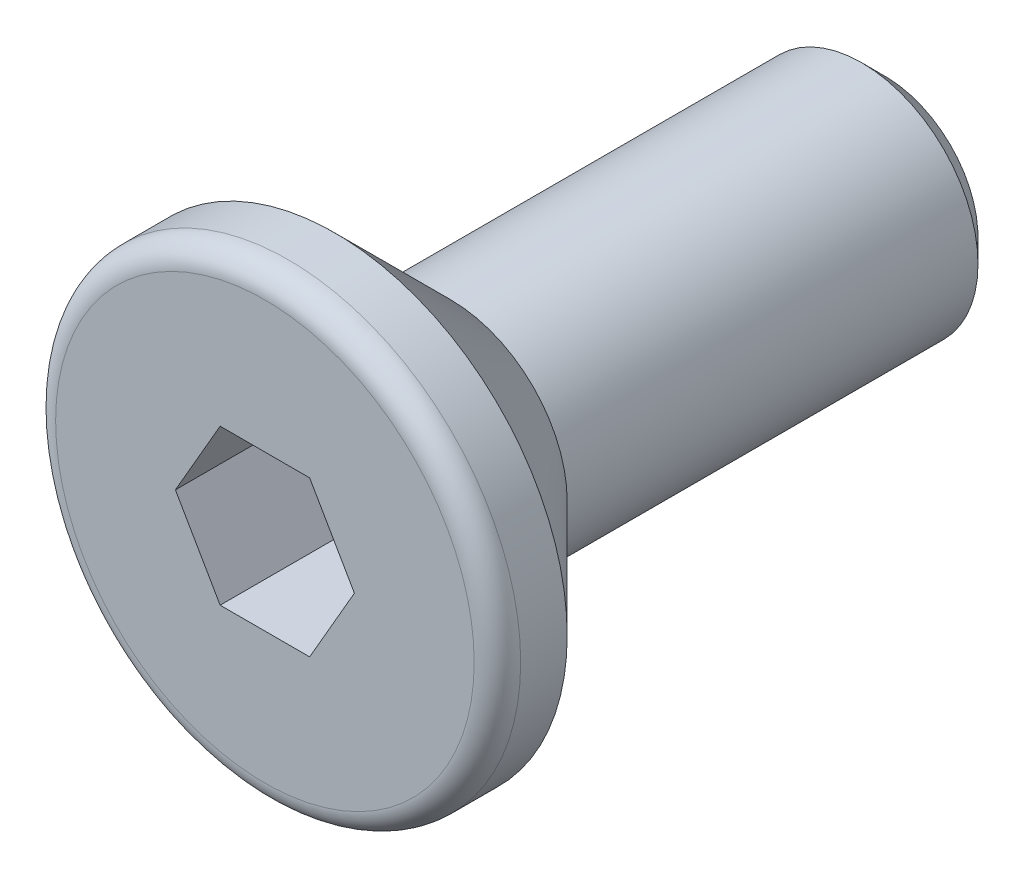
ISO-10303-21;
HEADER;
FILE_DESCRIPTION(('STEP AP214'),'2;1');
FILE_NAME('part.step','',(''),(''),'','','');
FILE_SCHEMA(('AUTOMOTIVE_DESIGN { 1 0 10303 214 1 1 1 1 }'));
ENDSEC;
DATA;
#1=APPLICATION_CONTEXT('core data for automotive mechanical design processes');
#2=APPLICATION_PROTOCOL_DEFINITION('international standard','automotive_design',2000,#1);
#3=PRODUCT_CONTEXT('',#1,'mechanical');
#4=PRODUCT('Part','Part','',(#3));
#5=PRODUCT_RELATED_PRODUCT_CATEGORY('part','',(#4));
#6=PRODUCT_DEFINITION_FORMATION('','',#4);
#7=PRODUCT_DEFINITION_CONTEXT('part definition',#1,'design');
#8=PRODUCT_DEFINITION('design','',#6,#7);
#9=PRODUCT_DEFINITION_SHAPE('','',#8);
#10=(LENGTH_UNIT() NAMED_UNIT(*) SI_UNIT(.MILLI.,.METRE.));
#11=(NAMED_UNIT(*) PLANE_ANGLE_UNIT() SI_UNIT($,.RADIAN.));
#12=(NAMED_UNIT(*) SI_UNIT($,.STERADIAN.) SOLID_ANGLE_UNIT());
#13=UNCERTAINTY_MEASURE_WITH_UNIT(LENGTH_MEASURE(1.E-05),#10,'distance_accuracy_value','');
#14=(GEOMETRIC_REPRESENTATION_CONTEXT(3) GLOBAL_UNCERTAINTY_ASSIGNED_CONTEXT((#13)) GLOBAL_UNIT_ASSIGNED_CONTEXT((#10,
#11,#12)) REPRESENTATION_CONTEXT('',''));
#15=CARTESIAN_POINT('',(0.,0.,0.));
#16=DIRECTION('',(0.,0.,1.));
#17=DIRECTION('',(1.,0.,0.));
#18=AXIS2_PLACEMENT_3D('',#15,#16,#17);
#19=CARTESIAN_POINT('',(0.,0.,4.));
#20=DIRECTION('',(0.,0.,1.));
#21=DIRECTION('',(1.,0.,0.));
#22=AXIS2_PLACEMENT_3D('',#19,#20,#21);
#23=PLANE('',#22);
#24=CARTESIAN_POINT('',(0.,0.,4.));
#25=DIRECTION('',(0.,0.,1.));
#26=DIRECTION('',(1.,0.,0.));
#27=AXIS2_PLACEMENT_3D('',#24,#25,#26);
#28=CIRCLE('',#27,2.7);
#29=CARTESIAN_POINT('',(2.7,0.,4.));
#30=VERTEX_POINT('',#29);
#31=EDGE_CURVE('E11',#30,#30,#28,.T.);
#32=ORIENTED_EDGE('',*,*,#31,.T.);
#33=EDGE_LOOP('',(#32));
#34=FACE_BOUND('',#33,.T.);
#35=DIRECTION('',(0.5,0.866025403784439,0.));
#36=VECTOR('',#35,1.);
#37=CARTESIAN_POINT('',(0.577350269189626,-1.,4.));
#38=LINE('',#37,#36);
#39=CARTESIAN_POINT('',(0.577350269189626,-1.,4.));
#40=VERTEX_POINT('',#39);
#41=CARTESIAN_POINT('',(1.15470053837925,0.,4.));
#42=VERTEX_POINT('',#41);
#43=EDGE_CURVE('E50',#40,#42,#38,.T.);
#44=ORIENTED_EDGE('',*,*,#43,.F.);
#45=DIRECTION('',(1.,0.,0.));
#46=VECTOR('',#45,1.);
#47=CARTESIAN_POINT('',(-0.577350269189626,-1.,4.));
#48=LINE('',#47,#46);
#49=CARTESIAN_POINT('',(-0.577350269189626,-1.,4.));
#50=VERTEX_POINT('',#49);
#51=EDGE_CURVE('E133',#50,#40,#48,.T.);
#52=ORIENTED_EDGE('',*,*,#51,.F.);
#53=DIRECTION('',(0.5,-0.866025403784438,0.));
#54=VECTOR('',#53,1.);
#55=CARTESIAN_POINT('',(-1.15470053837925,0.,4.));
#56=LINE('',#55,#54);
#57=CARTESIAN_POINT('',(-1.15470053837925,0.,4.));
#58=VERTEX_POINT('',#57);
#59=EDGE_CURVE('E131',#58,#50,#56,.T.);
#60=ORIENTED_EDGE('',*,*,#59,.F.);
#61=DIRECTION('',(-0.5,-0.866025403784439,0.));
#62=VECTOR('',#61,1.);
#63=CARTESIAN_POINT('',(-0.577350269189626,1.,4.));
#64=LINE('',#63,#62);
#65=CARTESIAN_POINT('',(-0.577350269189626,1.,4.));
#66=VERTEX_POINT('',#65);
#67=EDGE_CURVE('E98',#66,#58,#64,.T.);
#68=ORIENTED_EDGE('',*,*,#67,.F.);
#69=DIRECTION('',(-1.,0.,0.));
#70=VECTOR('',#69,1.);
#71=CARTESIAN_POINT('',(0.577350269189626,1.,4.));
#72=LINE('',#71,#70);
#73=CARTESIAN_POINT('',(0.577350269189626,1.,4.));
#74=VERTEX_POINT('',#73);
#75=EDGE_CURVE('E127',#74,#66,#72,.T.);
#76=ORIENTED_EDGE('',*,*,#75,.F.);
#77=DIRECTION('',(-0.5,0.866025403784438,0.));
#78=VECTOR('',#77,1.);
#79=CARTESIAN_POINT('',(1.15470053837925,0.,4.));
#80=LINE('',#79,#78);
#81=EDGE_CURVE('E124',#42,#74,#80,.T.);
#82=ORIENTED_EDGE('',*,*,#81,.F.);
#83=EDGE_LOOP('',(#44,#52,#60,#68,#76,#82));
#84=FACE_BOUND('',#83,.T.);
#85=ADVANCED_FACE('F35',(#34,#84),#23,.T.);
#86=CARTESIAN_POINT('',(0.,0.,-4.));
#87=DIRECTION('',(0.,0.,-1.));
#88=DIRECTION('',(-1.,0.,0.));
#89=AXIS2_PLACEMENT_3D('',#86,#87,#88);
#90=CYLINDRICAL_SURFACE('',#89,3.);
#91=CARTESIAN_POINT('',(0.,0.,3.7));
#92=DIRECTION('',(0.,0.,1.));
#93=DIRECTION('',(1.,0.,0.));
#94=AXIS2_PLACEMENT_3D('',#91,#92,#93);
#95=CIRCLE('',#94,3.);
#96=CARTESIAN_POINT('',(3.,0.,3.7));
#97=VERTEX_POINT('',#96);
#98=EDGE_CURVE('E43',#97,#97,#95,.F.);
#99=ORIENTED_EDGE('',*,*,#98,.T.);
#100=EDGE_LOOP('',(#99));
#101=FACE_BOUND('',#100,.T.);
#102=CARTESIAN_POINT('',(0.,0.,3.10000000000002));
#103=DIRECTION('',(0.,0.,-1.));
#104=DIRECTION('',(-1.,0.,0.));
#105=AXIS2_PLACEMENT_3D('',#102,#103,#104);
#106=CIRCLE('',#105,3.);
#107=CARTESIAN_POINT('',(-3.,0.,3.10000000000002));
#108=VERTEX_POINT('',#107);
#109=EDGE_CURVE('E151',#108,#108,#106,.T.);
#110=ORIENTED_EDGE('',*,*,#109,.F.);
#111=EDGE_LOOP('',(#110));
#112=FACE_BOUND('',#111,.T.);
#113=ADVANCED_FACE('F156',(#101,#112),#90,.T.);
#114=CARTESIAN_POINT('',(0.,0.,1.6));
#115=DIRECTION('',(0.,0.,1.));
#116=DIRECTION('',(1.,0.,0.));
#117=AXIS2_PLACEMENT_3D('',#114,#115,#116);
#118=CONICAL_SURFACE('',#117,1.5,0.785398163397443);
#119=ORIENTED_EDGE('',*,*,#109,.T.);
#120=EDGE_LOOP('',(#119));
#121=FACE_BOUND('',#120,.T.);
#122=CARTESIAN_POINT('',(0.,0.,1.6));
#123=DIRECTION('',(0.,0.,-1.));
#124=DIRECTION('',(-1.,0.,0.));
#125=AXIS2_PLACEMENT_3D('',#122,#123,#124);
#126=CIRCLE('',#125,1.5);
#127=CARTESIAN_POINT('',(-1.5,0.,1.6));
#128=VERTEX_POINT('',#127);
#129=EDGE_CURVE('E148',#128,#128,#126,.T.);
#130=ORIENTED_EDGE('',*,*,#129,.F.);
#131=EDGE_LOOP('',(#130));
#132=FACE_BOUND('',#131,.T.);
#133=ADVANCED_FACE('F172',(#121,#132),#118,.T.);
#134=CARTESIAN_POINT('',(0.,0.,-4.));
#135=DIRECTION('',(0.,0.,-1.));
#136=DIRECTION('',(-1.,0.,0.));
#137=AXIS2_PLACEMENT_3D('',#134,#135,#136);
#138=CYLINDRICAL_SURFACE('',#137,1.5);
#139=ORIENTED_EDGE('',*,*,#129,.T.);
#140=EDGE_LOOP('',(#139));
#141=FACE_BOUND('',#140,.T.);
#142=CARTESIAN_POINT('',(0.,0.,-3.7));
#143=DIRECTION('',(0.,0.,-1.));
#144=DIRECTION('',(-1.,0.,0.));
#145=AXIS2_PLACEMENT_3D('',#142,#143,#144);
#146=CIRCLE('',#145,1.5);
#147=CARTESIAN_POINT('',(-1.5,0.,-3.7));
#148=VERTEX_POINT('',#147);
#149=EDGE_CURVE('E145',#148,#148,#146,.T.);
#150=ORIENTED_EDGE('',*,*,#149,.F.);
#151=EDGE_LOOP('',(#150));
#152=FACE_BOUND('',#151,.T.);
#153=ADVANCED_FACE('F178',(#141,#152),#138,.T.);
#154=CARTESIAN_POINT('',(0.,0.,-4.));
#155=DIRECTION('',(0.,0.,1.));
#156=DIRECTION('',(1.,0.,0.));
#157=AXIS2_PLACEMENT_3D('',#154,#155,#156);
#158=CONICAL_SURFACE('',#157,1.2,0.785398163397442);
#159=ORIENTED_EDGE('',*,*,#149,.T.);
#160=EDGE_LOOP('',(#159));
#161=FACE_BOUND('',#160,.T.);
#162=CARTESIAN_POINT('',(0.,0.,-4.));
#163=DIRECTION('',(0.,0.,-1.));
#164=DIRECTION('',(-1.,0.,0.));
#165=AXIS2_PLACEMENT_3D('',#162,#163,#164);
#166=CIRCLE('',#165,1.2);
#167=CARTESIAN_POINT('',(-1.2,0.,-4.));
#168=VERTEX_POINT('',#167);
#169=EDGE_CURVE('E137',#168,#168,#166,.T.);
#170=ORIENTED_EDGE('',*,*,#169,.F.);
#171=EDGE_LOOP('',(#170));
#172=FACE_BOUND('',#171,.T.);
#173=ADVANCED_FACE('F182',(#161,#172),#158,.T.);
#174=CARTESIAN_POINT('',(0.,1.2,-4.));
#175=DIRECTION('',(0.,0.,-1.));
#176=DIRECTION('',(-1.,0.,0.));
#177=AXIS2_PLACEMENT_3D('',#174,#175,#176);
#178=PLANE('',#177);
#179=ORIENTED_EDGE('',*,*,#169,.T.);
#180=EDGE_LOOP('',(#179));
#181=FACE_BOUND('',#180,.T.);
#182=ADVANCED_FACE('F186',(#181),#178,.T.);
#183=CARTESIAN_POINT('',(0.577350269189626,-1.,2.5));
#184=DIRECTION('',(0.866025403784438,-0.5,0.));
#185=DIRECTION('',(0.5,0.866025403784439,0.));
#186=AXIS2_PLACEMENT_3D('',#183,#184,#185);
#187=PLANE('',#186);
#188=ORIENTED_EDGE('',*,*,#43,.T.);
#189=DIRECTION('',(0.,0.,1.));
#190=VECTOR('',#189,1.);
#191=CARTESIAN_POINT('',(1.15470053837925,0.,2.5));
#192=LINE('',#191,#190);
#193=CARTESIAN_POINT('',(1.15470053837925,0.,2.5));
#194=VERTEX_POINT('',#193);
#195=EDGE_CURVE('E80',#194,#42,#192,.T.);
#196=ORIENTED_EDGE('',*,*,#195,.F.);
#197=DIRECTION('',(0.5,0.866025403784439,0.));
#198=VECTOR('',#197,1.);
#199=CARTESIAN_POINT('',(0.577350269189626,-1.,2.5));
#200=LINE('',#199,#198);
#201=CARTESIAN_POINT('',(0.577350269189626,-1.,2.5));
#202=VERTEX_POINT('',#201);
#203=EDGE_CURVE('E135',#202,#194,#200,.T.);
#204=ORIENTED_EDGE('',*,*,#203,.F.);
#205=DIRECTION('',(0.,0.,1.));
#206=VECTOR('',#205,1.);
#207=CARTESIAN_POINT('',(0.577350269189626,-1.,2.5));
#208=LINE('',#207,#206);
#209=EDGE_CURVE('E58',#202,#40,#208,.T.);
#210=ORIENTED_EDGE('',*,*,#209,.T.);
#211=EDGE_LOOP('',(#188,#196,#204,#210));
#212=FACE_BOUND('',#211,.T.);
#213=ADVANCED_FACE('F190',(#212),#187,.F.);
#214=CARTESIAN_POINT('',(-0.577350269189626,-1.,2.5));
#215=DIRECTION('',(0.,-1.,0.));
#216=DIRECTION('',(1.,0.,0.));
#217=AXIS2_PLACEMENT_3D('',#214,#215,#216);
#218=PLANE('',#217);
#219=ORIENTED_EDGE('',*,*,#51,.T.);
#220=ORIENTED_EDGE('',*,*,#209,.F.);
#221=DIRECTION('',(1.,0.,0.));
#222=VECTOR('',#221,1.);
#223=CARTESIAN_POINT('',(-0.577350269189626,-1.,2.5));
#224=LINE('',#223,#222);
#225=CARTESIAN_POINT('',(-0.577350269189626,-1.,2.5));
#226=VERTEX_POINT('',#225);
#227=EDGE_CURVE('E110',#226,#202,#224,.T.);
#228=ORIENTED_EDGE('',*,*,#227,.F.);
#229=DIRECTION('',(0.,0.,1.));
#230=VECTOR('',#229,1.);
#231=CARTESIAN_POINT('',(-0.577350269189626,-1.,2.5));
#232=LINE('',#231,#230);
#233=EDGE_CURVE('E102',#226,#50,#232,.T.);
#234=ORIENTED_EDGE('',*,*,#233,.T.);
#235=EDGE_LOOP('',(#219,#220,#228,#234));
#236=FACE_BOUND('',#235,.T.);
#237=ADVANCED_FACE('F194',(#236),#218,.F.);
#238=CARTESIAN_POINT('',(-1.15470053837925,0.,2.5));
#239=DIRECTION('',(-0.866025403784439,-0.5,0.));
#240=DIRECTION('',(0.5,-0.866025403784439,0.));
#241=AXIS2_PLACEMENT_3D('',#238,#239,#240);
#242=PLANE('',#241);
#243=ORIENTED_EDGE('',*,*,#59,.T.);
#244=ORIENTED_EDGE('',*,*,#233,.F.);
#245=DIRECTION('',(0.5,-0.866025403784438,0.));
#246=VECTOR('',#245,1.);
#247=CARTESIAN_POINT('',(-1.15470053837925,0.,2.5));
#248=LINE('',#247,#246);
#249=CARTESIAN_POINT('',(-1.15470053837925,0.,2.5));
#250=VERTEX_POINT('',#249);
#251=EDGE_CURVE('E106',#250,#226,#248,.T.);
#252=ORIENTED_EDGE('',*,*,#251,.F.);
#253=DIRECTION('',(0.,0.,1.));
#254=VECTOR('',#253,1.);
#255=CARTESIAN_POINT('',(-1.15470053837925,0.,2.5));
#256=LINE('',#255,#254);
#257=EDGE_CURVE('E91',#250,#58,#256,.T.);
#258=ORIENTED_EDGE('',*,*,#257,.T.);
#259=EDGE_LOOP('',(#243,#244,#252,#258));
#260=FACE_BOUND('',#259,.T.);
#261=ADVANCED_FACE('F107',(#260),#242,.F.);
#262=CARTESIAN_POINT('',(-0.577350269189626,1.,2.5));
#263=DIRECTION('',(-0.866025403784439,0.5,0.));
#264=DIRECTION('',(-0.5,-0.866025403784439,0.));
#265=AXIS2_PLACEMENT_3D('',#262,#263,#264);
#266=PLANE('',#265);
#267=ORIENTED_EDGE('',*,*,#67,.T.);
#268=ORIENTED_EDGE('',*,*,#257,.F.);
#269=DIRECTION('',(-0.5,-0.866025403784439,0.));
#270=VECTOR('',#269,1.);
#271=CARTESIAN_POINT('',(-0.577350269189626,1.,2.5));
#272=LINE('',#271,#270);
#273=CARTESIAN_POINT('',(-0.577350269189626,1.,2.5));
#274=VERTEX_POINT('',#273);
#275=EDGE_CURVE('E95',#274,#250,#272,.T.);
#276=ORIENTED_EDGE('',*,*,#275,.F.);
#277=DIRECTION('',(0.,0.,1.));
#278=VECTOR('',#277,1.);
#279=CARTESIAN_POINT('',(-0.577350269189626,1.,2.5));
#280=LINE('',#279,#278);
#281=EDGE_CURVE('E103',#274,#66,#280,.T.);
#282=ORIENTED_EDGE('',*,*,#281,.T.);
#283=EDGE_LOOP('',(#267,#268,#276,#282));
#284=FACE_BOUND('',#283,.T.);
#285=ADVANCED_FACE('F93',(#284),#266,.F.);
#286=CARTESIAN_POINT('',(0.577350269189626,1.,2.5));
#287=DIRECTION('',(0.,1.,0.));
#288=DIRECTION('',(-1.,0.,0.));
#289=AXIS2_PLACEMENT_3D('',#286,#287,#288);
#290=PLANE('',#289);
#291=ORIENTED_EDGE('',*,*,#75,.T.);
#292=ORIENTED_EDGE('',*,*,#281,.F.);
#293=DIRECTION('',(-1.,0.,0.));
#294=VECTOR('',#293,1.);
#295=CARTESIAN_POINT('',(0.577350269189626,1.,2.5));
#296=LINE('',#295,#294);
#297=CARTESIAN_POINT('',(0.577350269189626,1.,2.5));
#298=VERTEX_POINT('',#297);
#299=EDGE_CURVE('E116',#298,#274,#296,.T.);
#300=ORIENTED_EDGE('',*,*,#299,.F.);
#301=DIRECTION('',(0.,0.,1.));
#302=VECTOR('',#301,1.);
#303=CARTESIAN_POINT('',(0.577350269189626,1.,2.5));
#304=LINE('',#303,#302);
#305=EDGE_CURVE('E140',#298,#74,#304,.T.);
#306=ORIENTED_EDGE('',*,*,#305,.T.);
#307=EDGE_LOOP('',(#291,#292,#300,#306));
#308=FACE_BOUND('',#307,.T.);
#309=ADVANCED_FACE('F197',(#308),#290,.F.);
#310=CARTESIAN_POINT('',(1.15470053837925,0.,2.5));
#311=DIRECTION('',(0.866025403784439,0.5,0.));
#312=DIRECTION('',(-0.5,0.866025403784439,0.));
#313=AXIS2_PLACEMENT_3D('',#310,#311,#312);
#314=PLANE('',#313);
#315=ORIENTED_EDGE('',*,*,#81,.T.);
#316=ORIENTED_EDGE('',*,*,#305,.F.);
#317=DIRECTION('',(-0.5,0.866025403784438,0.));
#318=VECTOR('',#317,1.);
#319=CARTESIAN_POINT('',(1.15470053837925,0.,2.5));
#320=LINE('',#319,#318);
#321=EDGE_CURVE('E118',#194,#298,#320,.T.);
#322=ORIENTED_EDGE('',*,*,#321,.F.);
#323=ORIENTED_EDGE('',*,*,#195,.T.);
#324=EDGE_LOOP('',(#315,#316,#322,#323));
#325=FACE_BOUND('',#324,.T.);
#326=ADVANCED_FACE('F164',(#325),#314,.F.);
#327=CARTESIAN_POINT('',(0.,0.,2.5));
#328=DIRECTION('',(0.,0.,1.));
#329=DIRECTION('',(1.,0.,0.));
#330=AXIS2_PLACEMENT_3D('',#327,#328,#329);
#331=PLANE('',#330);
#332=ORIENTED_EDGE('',*,*,#203,.T.);
#333=ORIENTED_EDGE('',*,*,#321,.T.);
#334=ORIENTED_EDGE('',*,*,#299,.T.);
#335=ORIENTED_EDGE('',*,*,#275,.T.);
#336=ORIENTED_EDGE('',*,*,#251,.T.);
#337=ORIENTED_EDGE('',*,*,#227,.T.);
#338=EDGE_LOOP('',(#332,#333,#334,#335,#336,#337));
#339=FACE_BOUND('',#338,.T.);
#340=ADVANCED_FACE('F113',(#339),#331,.T.);
#341=CARTESIAN_POINT('',(0.,0.,3.7));
#342=DIRECTION('',(0.,0.,1.));
#343=DIRECTION('',(1.,0.,0.));
#344=AXIS2_PLACEMENT_3D('',#341,#342,#343);
#345=TOROIDAL_SURFACE('',#344,2.7,0.3);
#346=ORIENTED_EDGE('',*,*,#31,.F.);
#347=EDGE_LOOP('',(#346));
#348=FACE_BOUND('',#347,.T.);
#349=ORIENTED_EDGE('',*,*,#98,.F.);
#350=EDGE_LOOP('',(#349));
#351=FACE_BOUND('',#350,.T.);
#352=ADVANCED_FACE('F37',(#348,#351),#345,.T.);
#353=CLOSED_SHELL('',(#85,#113,#133,#153,#173,#182,#213,#237,#261,#285,#309,#326,#340,#352));
#354=MANIFOLD_SOLID_BREP('B2',#353);
#355=ADVANCED_BREP_SHAPE_REPRESENTATION('',(#18,#354),#14);
#356=SHAPE_DEFINITION_REPRESENTATION(#9,#355);
ENDSEC;
END-ISO-10303-21;
